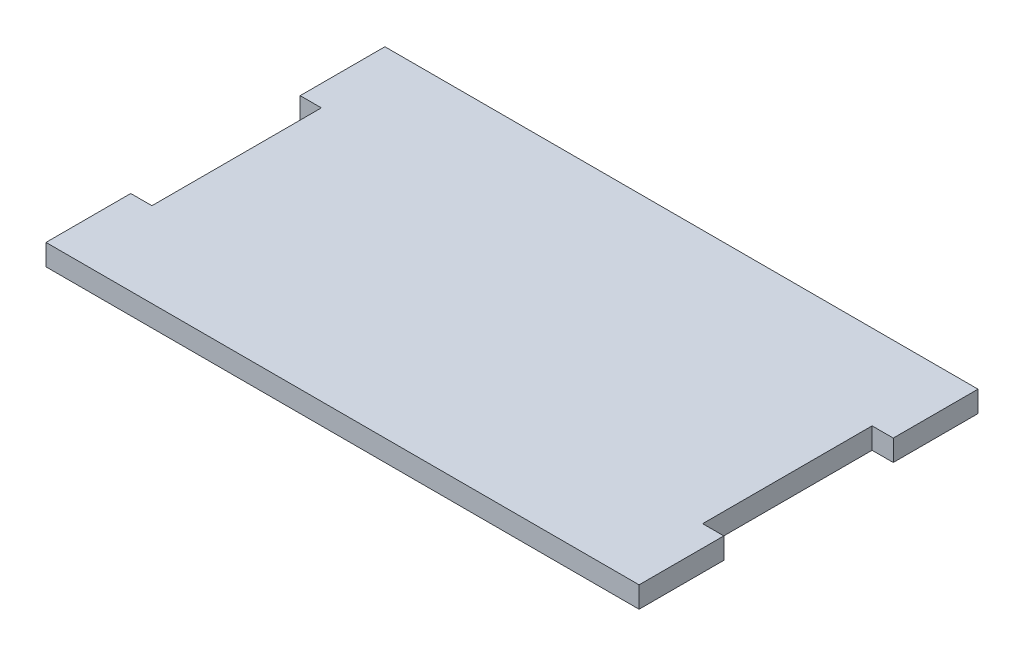
ISO-10303-21;
HEADER;
FILE_DESCRIPTION(('STEP AP214'),'2;1');
FILE_NAME('part.step','',(''),(''),'','','');
FILE_SCHEMA(('AUTOMOTIVE_DESIGN { 1 0 10303 214 1 1 1 1 }'));
ENDSEC;
DATA;
#1=APPLICATION_CONTEXT('core data for automotive mechanical design processes');
#2=APPLICATION_PROTOCOL_DEFINITION('international standard','automotive_design',2000,#1);
#3=PRODUCT_CONTEXT('',#1,'mechanical');
#4=PRODUCT('Part','Part','',(#3));
#5=PRODUCT_RELATED_PRODUCT_CATEGORY('part','',(#4));
#6=PRODUCT_DEFINITION_FORMATION('','',#4);
#7=PRODUCT_DEFINITION_CONTEXT('part definition',#1,'design');
#8=PRODUCT_DEFINITION('design','',#6,#7);
#9=PRODUCT_DEFINITION_SHAPE('','',#8);
#10=(LENGTH_UNIT() NAMED_UNIT(*) SI_UNIT(.MILLI.,.METRE.));
#11=(NAMED_UNIT(*) PLANE_ANGLE_UNIT() SI_UNIT($,.RADIAN.));
#12=(NAMED_UNIT(*) SI_UNIT($,.STERADIAN.) SOLID_ANGLE_UNIT());
#13=UNCERTAINTY_MEASURE_WITH_UNIT(LENGTH_MEASURE(1.E-05),#10,'distance_accuracy_value','');
#14=(GEOMETRIC_REPRESENTATION_CONTEXT(3) GLOBAL_UNCERTAINTY_ASSIGNED_CONTEXT((#13)) GLOBAL_UNIT_ASSIGNED_CONTEXT((#10,
#11,#12)) REPRESENTATION_CONTEXT('',''));
#15=CARTESIAN_POINT('',(0.,0.,0.));
#16=DIRECTION('',(0.,0.,1.));
#17=DIRECTION('',(1.,0.,0.));
#18=AXIS2_PLACEMENT_3D('',#15,#16,#17);
#19=CARTESIAN_POINT('',(44.45,3.175,-25.4));
#20=DIRECTION('',(-1.,0.,0.));
#21=DIRECTION('',(0.,0.,1.));
#22=AXIS2_PLACEMENT_3D('',#19,#20,#21);
#23=PLANE('',#22);
#24=DIRECTION('',(0.,0.,-1.));
#25=VECTOR('',#24,1.);
#26=CARTESIAN_POINT('',(44.45,0.,-25.4));
#27=LINE('',#26,#25);
#28=CARTESIAN_POINT('',(44.45,0.,-12.7));
#29=VERTEX_POINT('',#28);
#30=CARTESIAN_POINT('',(44.45,0.,-25.4));
#31=VERTEX_POINT('',#30);
#32=EDGE_CURVE('E249',#29,#31,#27,.T.);
#33=ORIENTED_EDGE('',*,*,#32,.T.);
#34=DIRECTION('',(0.,-1.,0.));
#35=VECTOR('',#34,1.);
#36=CARTESIAN_POINT('',(44.45,3.175,-25.4));
#37=LINE('',#36,#35);
#38=CARTESIAN_POINT('',(44.45,3.175,-25.4));
#39=VERTEX_POINT('',#38);
#40=EDGE_CURVE('E12',#39,#31,#37,.T.);
#41=ORIENTED_EDGE('',*,*,#40,.F.);
#42=DIRECTION('',(0.,0.,-1.));
#43=VECTOR('',#42,1.);
#44=CARTESIAN_POINT('',(44.45,3.175,-25.4));
#45=LINE('',#44,#43);
#46=CARTESIAN_POINT('',(44.45,3.175,-12.7));
#47=VERTEX_POINT('',#46);
#48=EDGE_CURVE('E202',#47,#39,#45,.T.);
#49=ORIENTED_EDGE('',*,*,#48,.F.);
#50=DIRECTION('',(0.,-1.,0.));
#51=VECTOR('',#50,1.);
#52=CARTESIAN_POINT('',(44.45,3.175,-12.7));
#53=LINE('',#52,#51);
#54=EDGE_CURVE('E158',#47,#29,#53,.T.);
#55=ORIENTED_EDGE('',*,*,#54,.T.);
#56=EDGE_LOOP('',(#33,#41,#49,#55));
#57=FACE_BOUND('',#56,.T.);
#58=ADVANCED_FACE('F39',(#57),#23,.F.);
#59=CARTESIAN_POINT('',(-41.275,3.175,-25.4));
#60=DIRECTION('',(0.,0.,1.));
#61=DIRECTION('',(1.,0.,0.));
#62=AXIS2_PLACEMENT_3D('',#59,#60,#61);
#63=PLANE('',#62);
#64=DIRECTION('',(-1.,0.,0.));
#65=VECTOR('',#64,1.);
#66=CARTESIAN_POINT('',(-41.275,0.,-25.4));
#67=LINE('',#66,#65);
#68=CARTESIAN_POINT('',(-44.45,0.,-25.4));
#69=VERTEX_POINT('',#68);
#70=EDGE_CURVE('E243',#31,#69,#67,.T.);
#71=ORIENTED_EDGE('',*,*,#70,.T.);
#72=DIRECTION('',(0.,-1.,0.));
#73=VECTOR('',#72,1.);
#74=CARTESIAN_POINT('',(-44.45,3.175,-25.4));
#75=LINE('',#74,#73);
#76=CARTESIAN_POINT('',(-44.45,3.175,-25.4));
#77=VERTEX_POINT('',#76);
#78=EDGE_CURVE('E47',#77,#69,#75,.T.);
#79=ORIENTED_EDGE('',*,*,#78,.F.);
#80=DIRECTION('',(-1.,0.,0.));
#81=VECTOR('',#80,1.);
#82=CARTESIAN_POINT('',(41.275,3.175,-25.4));
#83=LINE('',#82,#81);
#84=EDGE_CURVE('E110',#39,#77,#83,.T.);
#85=ORIENTED_EDGE('',*,*,#84,.F.);
#86=ORIENTED_EDGE('',*,*,#40,.T.);
#87=EDGE_LOOP('',(#71,#79,#85,#86));
#88=FACE_BOUND('',#87,.T.);
#89=ADVANCED_FACE('F278',(#88),#63,.F.);
#90=CARTESIAN_POINT('',(-44.45,3.175,-25.4));
#91=DIRECTION('',(1.,0.,0.));
#92=DIRECTION('',(0.,0.,-1.));
#93=AXIS2_PLACEMENT_3D('',#90,#91,#92);
#94=PLANE('',#93);
#95=DIRECTION('',(0.,0.,1.));
#96=VECTOR('',#95,1.);
#97=CARTESIAN_POINT('',(-44.45,0.,-25.4));
#98=LINE('',#97,#96);
#99=CARTESIAN_POINT('',(-44.45,0.,-12.7));
#100=VERTEX_POINT('',#99);
#101=EDGE_CURVE('E238',#69,#100,#98,.T.);
#102=ORIENTED_EDGE('',*,*,#101,.T.);
#103=DIRECTION('',(0.,-1.,0.));
#104=VECTOR('',#103,1.);
#105=CARTESIAN_POINT('',(-44.45,3.175,-12.7));
#106=LINE('',#105,#104);
#107=CARTESIAN_POINT('',(-44.45,3.175,-12.7));
#108=VERTEX_POINT('',#107);
#109=EDGE_CURVE('E230',#108,#100,#106,.T.);
#110=ORIENTED_EDGE('',*,*,#109,.F.);
#111=DIRECTION('',(0.,0.,1.));
#112=VECTOR('',#111,1.);
#113=CARTESIAN_POINT('',(-44.45,3.175,-25.4));
#114=LINE('',#113,#112);
#115=EDGE_CURVE('E194',#77,#108,#114,.T.);
#116=ORIENTED_EDGE('',*,*,#115,.F.);
#117=ORIENTED_EDGE('',*,*,#78,.T.);
#118=EDGE_LOOP('',(#102,#110,#116,#117));
#119=FACE_BOUND('',#118,.T.);
#120=ADVANCED_FACE('F236',(#119),#94,.F.);
#121=CARTESIAN_POINT('',(-44.45,3.175,-12.7));
#122=DIRECTION('',(0.,0.,-1.));
#123=DIRECTION('',(-1.,0.,0.));
#124=AXIS2_PLACEMENT_3D('',#121,#122,#123);
#125=PLANE('',#124);
#126=DIRECTION('',(1.,0.,0.));
#127=VECTOR('',#126,1.);
#128=CARTESIAN_POINT('',(-44.45,0.,-12.7));
#129=LINE('',#128,#127);
#130=CARTESIAN_POINT('',(-41.275,0.,-12.7));
#131=VERTEX_POINT('',#130);
#132=EDGE_CURVE('E245',#100,#131,#129,.T.);
#133=ORIENTED_EDGE('',*,*,#132,.T.);
#134=DIRECTION('',(0.,-1.,0.));
#135=VECTOR('',#134,1.);
#136=CARTESIAN_POINT('',(-41.275,3.175,-12.7));
#137=LINE('',#136,#135);
#138=CARTESIAN_POINT('',(-41.275,3.175,-12.7));
#139=VERTEX_POINT('',#138);
#140=EDGE_CURVE('E227',#139,#131,#137,.T.);
#141=ORIENTED_EDGE('',*,*,#140,.F.);
#142=DIRECTION('',(1.,0.,0.));
#143=VECTOR('',#142,1.);
#144=CARTESIAN_POINT('',(-44.45,3.175,-12.7));
#145=LINE('',#144,#143);
#146=EDGE_CURVE('E190',#108,#139,#145,.T.);
#147=ORIENTED_EDGE('',*,*,#146,.F.);
#148=ORIENTED_EDGE('',*,*,#109,.T.);
#149=EDGE_LOOP('',(#133,#141,#147,#148));
#150=FACE_BOUND('',#149,.T.);
#151=ADVANCED_FACE('F285',(#150),#125,.F.);
#152=CARTESIAN_POINT('',(-41.275,3.175,12.7));
#153=DIRECTION('',(1.,0.,0.));
#154=DIRECTION('',(0.,0.,-1.));
#155=AXIS2_PLACEMENT_3D('',#152,#153,#154);
#156=PLANE('',#155);
#157=DIRECTION('',(0.,0.,1.));
#158=VECTOR('',#157,1.);
#159=CARTESIAN_POINT('',(-41.275,0.,12.7));
#160=LINE('',#159,#158);
#161=CARTESIAN_POINT('',(-41.275,0.,12.7));
#162=VERTEX_POINT('',#161);
#163=EDGE_CURVE('E247',#131,#162,#160,.T.);
#164=ORIENTED_EDGE('',*,*,#163,.T.);
#165=DIRECTION('',(0.,-1.,0.));
#166=VECTOR('',#165,1.);
#167=CARTESIAN_POINT('',(-41.275,3.175,12.7));
#168=LINE('',#167,#166);
#169=CARTESIAN_POINT('',(-41.275,3.175,12.7));
#170=VERTEX_POINT('',#169);
#171=EDGE_CURVE('E224',#170,#162,#168,.T.);
#172=ORIENTED_EDGE('',*,*,#171,.F.);
#173=DIRECTION('',(0.,0.,1.));
#174=VECTOR('',#173,1.);
#175=CARTESIAN_POINT('',(-41.275,3.175,12.7));
#176=LINE('',#175,#174);
#177=EDGE_CURVE('E187',#139,#170,#176,.T.);
#178=ORIENTED_EDGE('',*,*,#177,.F.);
#179=ORIENTED_EDGE('',*,*,#140,.T.);
#180=EDGE_LOOP('',(#164,#172,#178,#179));
#181=FACE_BOUND('',#180,.T.);
#182=ADVANCED_FACE('F290',(#181),#156,.F.);
#183=CARTESIAN_POINT('',(-44.45,3.175,12.7));
#184=DIRECTION('',(0.,0.,1.));
#185=DIRECTION('',(1.,0.,0.));
#186=AXIS2_PLACEMENT_3D('',#183,#184,#185);
#187=PLANE('',#186);
#188=DIRECTION('',(-1.,0.,0.));
#189=VECTOR('',#188,1.);
#190=CARTESIAN_POINT('',(-44.45,0.,12.7));
#191=LINE('',#190,#189);
#192=CARTESIAN_POINT('',(-44.45,0.,12.7));
#193=VERTEX_POINT('',#192);
#194=EDGE_CURVE('E253',#162,#193,#191,.T.);
#195=ORIENTED_EDGE('',*,*,#194,.T.);
#196=DIRECTION('',(0.,-1.,0.));
#197=VECTOR('',#196,1.);
#198=CARTESIAN_POINT('',(-44.45,3.175,12.7));
#199=LINE('',#198,#197);
#200=CARTESIAN_POINT('',(-44.45,3.175,12.7));
#201=VERTEX_POINT('',#200);
#202=EDGE_CURVE('E221',#201,#193,#199,.T.);
#203=ORIENTED_EDGE('',*,*,#202,.F.);
#204=DIRECTION('',(-1.,0.,0.));
#205=VECTOR('',#204,1.);
#206=CARTESIAN_POINT('',(-44.45,3.175,12.7));
#207=LINE('',#206,#205);
#208=EDGE_CURVE('E179',#170,#201,#207,.T.);
#209=ORIENTED_EDGE('',*,*,#208,.F.);
#210=ORIENTED_EDGE('',*,*,#171,.T.);
#211=EDGE_LOOP('',(#195,#203,#209,#210));
#212=FACE_BOUND('',#211,.T.);
#213=ADVANCED_FACE('F294',(#212),#187,.F.);
#214=CARTESIAN_POINT('',(-44.45,3.175,25.4));
#215=DIRECTION('',(1.,0.,0.));
#216=DIRECTION('',(0.,0.,-1.));
#217=AXIS2_PLACEMENT_3D('',#214,#215,#216);
#218=PLANE('',#217);
#219=DIRECTION('',(0.,0.,1.));
#220=VECTOR('',#219,1.);
#221=CARTESIAN_POINT('',(-44.45,0.,25.4));
#222=LINE('',#221,#220);
#223=CARTESIAN_POINT('',(-44.45,0.,25.4));
#224=VERTEX_POINT('',#223);
#225=EDGE_CURVE('E255',#193,#224,#222,.T.);
#226=ORIENTED_EDGE('',*,*,#225,.T.);
#227=DIRECTION('',(0.,-1.,0.));
#228=VECTOR('',#227,1.);
#229=CARTESIAN_POINT('',(-44.45,3.175,25.4));
#230=LINE('',#229,#228);
#231=CARTESIAN_POINT('',(-44.45,3.175,25.4));
#232=VERTEX_POINT('',#231);
#233=EDGE_CURVE('E218',#232,#224,#230,.T.);
#234=ORIENTED_EDGE('',*,*,#233,.F.);
#235=DIRECTION('',(0.,0.,1.));
#236=VECTOR('',#235,1.);
#237=CARTESIAN_POINT('',(-44.45,3.175,25.4));
#238=LINE('',#237,#236);
#239=EDGE_CURVE('E175',#201,#232,#238,.T.);
#240=ORIENTED_EDGE('',*,*,#239,.F.);
#241=ORIENTED_EDGE('',*,*,#202,.T.);
#242=EDGE_LOOP('',(#226,#234,#240,#241));
#243=FACE_BOUND('',#242,.T.);
#244=ADVANCED_FACE('F298',(#243),#218,.F.);
#245=CARTESIAN_POINT('',(41.275,3.175,25.4));
#246=DIRECTION('',(0.,0.,-1.));
#247=DIRECTION('',(-1.,0.,0.));
#248=AXIS2_PLACEMENT_3D('',#245,#246,#247);
#249=PLANE('',#248);
#250=DIRECTION('',(1.,0.,0.));
#251=VECTOR('',#250,1.);
#252=CARTESIAN_POINT('',(41.275,0.,25.4));
#253=LINE('',#252,#251);
#254=CARTESIAN_POINT('',(44.45,0.,25.4));
#255=VERTEX_POINT('',#254);
#256=EDGE_CURVE('E258',#224,#255,#253,.T.);
#257=ORIENTED_EDGE('',*,*,#256,.T.);
#258=DIRECTION('',(0.,-1.,0.));
#259=VECTOR('',#258,1.);
#260=CARTESIAN_POINT('',(44.45,3.175,25.4));
#261=LINE('',#260,#259);
#262=CARTESIAN_POINT('',(44.45,3.175,25.4));
#263=VERTEX_POINT('',#262);
#264=EDGE_CURVE('E215',#263,#255,#261,.T.);
#265=ORIENTED_EDGE('',*,*,#264,.F.);
#266=DIRECTION('',(1.,0.,0.));
#267=VECTOR('',#266,1.);
#268=CARTESIAN_POINT('',(-41.275,3.175,25.4));
#269=LINE('',#268,#267);
#270=EDGE_CURVE('E171',#232,#263,#269,.T.);
#271=ORIENTED_EDGE('',*,*,#270,.F.);
#272=ORIENTED_EDGE('',*,*,#233,.T.);
#273=EDGE_LOOP('',(#257,#265,#271,#272));
#274=FACE_BOUND('',#273,.T.);
#275=ADVANCED_FACE('F302',(#274),#249,.F.);
#276=CARTESIAN_POINT('',(44.45,3.175,25.4));
#277=DIRECTION('',(-1.,0.,0.));
#278=DIRECTION('',(0.,0.,1.));
#279=AXIS2_PLACEMENT_3D('',#276,#277,#278);
#280=PLANE('',#279);
#281=DIRECTION('',(0.,0.,-1.));
#282=VECTOR('',#281,1.);
#283=CARTESIAN_POINT('',(44.45,0.,25.4));
#284=LINE('',#283,#282);
#285=CARTESIAN_POINT('',(44.45,0.,12.7));
#286=VERTEX_POINT('',#285);
#287=EDGE_CURVE('E260',#255,#286,#284,.T.);
#288=ORIENTED_EDGE('',*,*,#287,.T.);
#289=DIRECTION('',(0.,-1.,0.));
#290=VECTOR('',#289,1.);
#291=CARTESIAN_POINT('',(44.45,3.175,12.7));
#292=LINE('',#291,#290);
#293=CARTESIAN_POINT('',(44.45,3.175,12.7));
#294=VERTEX_POINT('',#293);
#295=EDGE_CURVE('E151',#294,#286,#292,.T.);
#296=ORIENTED_EDGE('',*,*,#295,.F.);
#297=DIRECTION('',(0.,0.,-1.));
#298=VECTOR('',#297,1.);
#299=CARTESIAN_POINT('',(44.45,3.175,25.4));
#300=LINE('',#299,#298);
#301=EDGE_CURVE('E141',#263,#294,#300,.T.);
#302=ORIENTED_EDGE('',*,*,#301,.F.);
#303=ORIENTED_EDGE('',*,*,#264,.T.);
#304=EDGE_LOOP('',(#288,#296,#302,#303));
#305=FACE_BOUND('',#304,.T.);
#306=ADVANCED_FACE('F263',(#305),#280,.F.);
#307=CARTESIAN_POINT('',(44.45,3.175,12.7));
#308=DIRECTION('',(0.,0.,1.));
#309=DIRECTION('',(1.,0.,0.));
#310=AXIS2_PLACEMENT_3D('',#307,#308,#309);
#311=PLANE('',#310);
#312=DIRECTION('',(-1.,0.,0.));
#313=VECTOR('',#312,1.);
#314=CARTESIAN_POINT('',(44.45,0.,12.7));
#315=LINE('',#314,#313);
#316=CARTESIAN_POINT('',(41.2750000000001,0.,12.7));
#317=VERTEX_POINT('',#316);
#318=EDGE_CURVE('E150',#286,#317,#315,.T.);
#319=ORIENTED_EDGE('',*,*,#318,.T.);
#320=DIRECTION('',(0.,-1.,0.));
#321=VECTOR('',#320,1.);
#322=CARTESIAN_POINT('',(41.2750000000001,3.175,12.7));
#323=LINE('',#322,#321);
#324=CARTESIAN_POINT('',(41.2750000000001,3.175,12.7));
#325=VERTEX_POINT('',#324);
#326=EDGE_CURVE('E147',#325,#317,#323,.T.);
#327=ORIENTED_EDGE('',*,*,#326,.F.);
#328=DIRECTION('',(-1.,0.,0.));
#329=VECTOR('',#328,1.);
#330=CARTESIAN_POINT('',(44.45,3.175,12.7));
#331=LINE('',#330,#329);
#332=EDGE_CURVE('E135',#294,#325,#331,.T.);
#333=ORIENTED_EDGE('',*,*,#332,.F.);
#334=ORIENTED_EDGE('',*,*,#295,.T.);
#335=EDGE_LOOP('',(#319,#327,#333,#334));
#336=FACE_BOUND('',#335,.T.);
#337=ADVANCED_FACE('F148',(#336),#311,.F.);
#338=CARTESIAN_POINT('',(41.2750000000001,3.175,12.7));
#339=DIRECTION('',(-1.,0.,0.));
#340=DIRECTION('',(0.,0.,1.));
#341=AXIS2_PLACEMENT_3D('',#338,#339,#340);
#342=PLANE('',#341);
#343=DIRECTION('',(0.,0.,-1.));
#344=VECTOR('',#343,1.);
#345=CARTESIAN_POINT('',(41.2750000000001,0.,12.7));
#346=LINE('',#345,#344);
#347=CARTESIAN_POINT('',(41.2750000000001,0.,-12.7));
#348=VERTEX_POINT('',#347);
#349=EDGE_CURVE('E96',#317,#348,#346,.T.);
#350=ORIENTED_EDGE('',*,*,#349,.T.);
#351=DIRECTION('',(0.,-1.,0.));
#352=VECTOR('',#351,1.);
#353=CARTESIAN_POINT('',(41.2750000000001,3.175,-12.7));
#354=LINE('',#353,#352);
#355=CARTESIAN_POINT('',(41.2750000000001,3.175,-12.7));
#356=VERTEX_POINT('',#355);
#357=EDGE_CURVE('E152',#356,#348,#354,.T.);
#358=ORIENTED_EDGE('',*,*,#357,.F.);
#359=DIRECTION('',(0.,0.,-1.));
#360=VECTOR('',#359,1.);
#361=CARTESIAN_POINT('',(41.2750000000001,3.175,12.7));
#362=LINE('',#361,#360);
#363=EDGE_CURVE('E139',#325,#356,#362,.T.);
#364=ORIENTED_EDGE('',*,*,#363,.F.);
#365=ORIENTED_EDGE('',*,*,#326,.T.);
#366=EDGE_LOOP('',(#350,#358,#364,#365));
#367=FACE_BOUND('',#366,.T.);
#368=ADVANCED_FACE('F154',(#367),#342,.F.);
#369=CARTESIAN_POINT('',(44.45,3.175,-12.7));
#370=DIRECTION('',(0.,0.,-1.));
#371=DIRECTION('',(-1.,0.,0.));
#372=AXIS2_PLACEMENT_3D('',#369,#370,#371);
#373=PLANE('',#372);
#374=DIRECTION('',(1.,0.,0.));
#375=VECTOR('',#374,1.);
#376=CARTESIAN_POINT('',(44.45,0.,-12.7));
#377=LINE('',#376,#375);
#378=EDGE_CURVE('E102',#348,#29,#377,.T.);
#379=ORIENTED_EDGE('',*,*,#378,.T.);
#380=ORIENTED_EDGE('',*,*,#54,.F.);
#381=DIRECTION('',(1.,0.,0.));
#382=VECTOR('',#381,1.);
#383=CARTESIAN_POINT('',(44.45,3.175,-12.7));
#384=LINE('',#383,#382);
#385=EDGE_CURVE('E55',#356,#47,#384,.T.);
#386=ORIENTED_EDGE('',*,*,#385,.F.);
#387=ORIENTED_EDGE('',*,*,#357,.T.);
#388=EDGE_LOOP('',(#379,#380,#386,#387));
#389=FACE_BOUND('',#388,.T.);
#390=ADVANCED_FACE('F267',(#389),#373,.F.);
#391=CARTESIAN_POINT('',(0.,3.175,0.));
#392=DIRECTION('',(0.,-1.,0.));
#393=DIRECTION('',(0.,0.,-1.));
#394=AXIS2_PLACEMENT_3D('',#391,#392,#393);
#395=PLANE('',#394);
#396=ORIENTED_EDGE('',*,*,#48,.T.);
#397=ORIENTED_EDGE('',*,*,#84,.T.);
#398=ORIENTED_EDGE('',*,*,#115,.T.);
#399=ORIENTED_EDGE('',*,*,#146,.T.);
#400=ORIENTED_EDGE('',*,*,#177,.T.);
#401=ORIENTED_EDGE('',*,*,#208,.T.);
#402=ORIENTED_EDGE('',*,*,#239,.T.);
#403=ORIENTED_EDGE('',*,*,#270,.T.);
#404=ORIENTED_EDGE('',*,*,#301,.T.);
#405=ORIENTED_EDGE('',*,*,#332,.T.);
#406=ORIENTED_EDGE('',*,*,#363,.T.);
#407=ORIENTED_EDGE('',*,*,#385,.T.);
#408=EDGE_LOOP('',(#396,#397,#398,#399,#400,#401,#402,#403,#404,#405,#406,#407));
#409=FACE_BOUND('',#408,.T.);
#410=ADVANCED_FACE('F137',(#409),#395,.F.);
#411=CARTESIAN_POINT('',(0.,0.,0.));
#412=DIRECTION('',(0.,-1.,0.));
#413=DIRECTION('',(0.,0.,-1.));
#414=AXIS2_PLACEMENT_3D('',#411,#412,#413);
#415=PLANE('',#414);
#416=ORIENTED_EDGE('',*,*,#32,.F.);
#417=ORIENTED_EDGE('',*,*,#378,.F.);
#418=ORIENTED_EDGE('',*,*,#349,.F.);
#419=ORIENTED_EDGE('',*,*,#318,.F.);
#420=ORIENTED_EDGE('',*,*,#287,.F.);
#421=ORIENTED_EDGE('',*,*,#256,.F.);
#422=ORIENTED_EDGE('',*,*,#225,.F.);
#423=ORIENTED_EDGE('',*,*,#194,.F.);
#424=ORIENTED_EDGE('',*,*,#163,.F.);
#425=ORIENTED_EDGE('',*,*,#132,.F.);
#426=ORIENTED_EDGE('',*,*,#101,.F.);
#427=ORIENTED_EDGE('',*,*,#70,.F.);
#428=EDGE_LOOP('',(#416,#417,#418,#419,#420,#421,#422,#423,#424,#425,#426,#427));
#429=FACE_BOUND('',#428,.T.);
#430=ADVANCED_FACE('F242',(#429),#415,.T.);
#431=CLOSED_SHELL('',(#58,#89,#120,#151,#182,#213,#244,#275,#306,#337,#368,#390,#410,#430));
#432=MANIFOLD_SOLID_BREP('B2',#431);
#433=ADVANCED_BREP_SHAPE_REPRESENTATION('',(#18,#432),#14);
#434=SHAPE_DEFINITION_REPRESENTATION(#9,#433);
ENDSEC;
END-ISO-10303-21;
